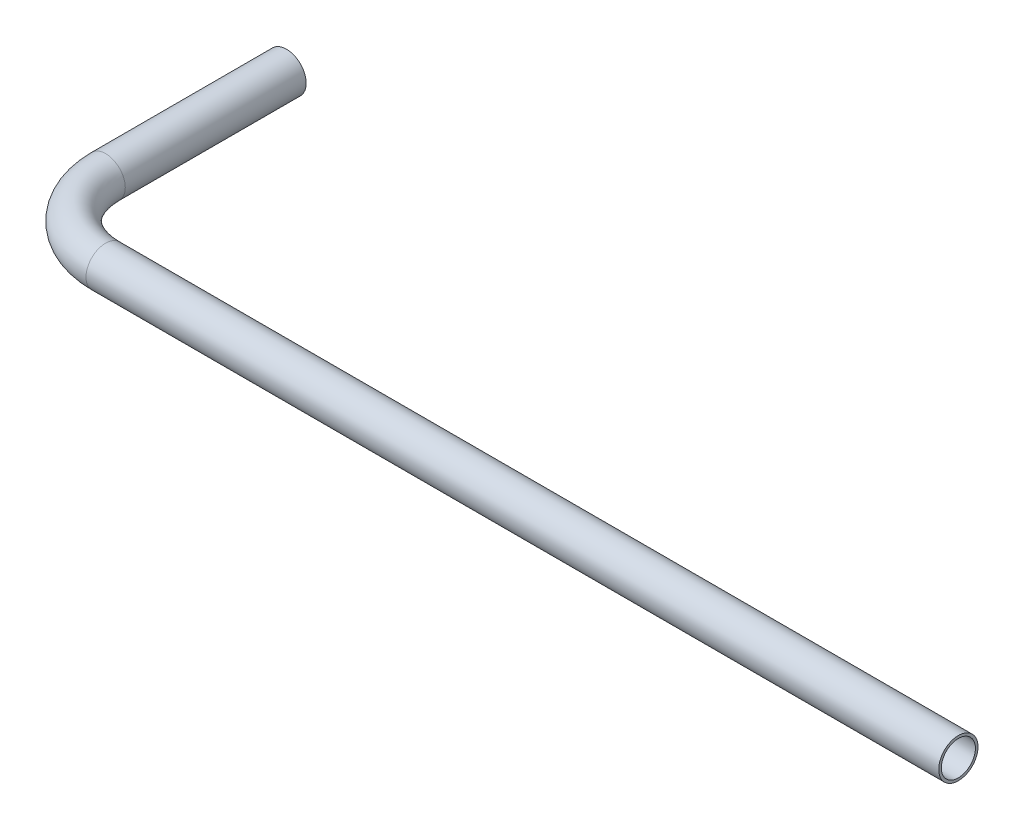
ISO-10303-21;
HEADER;
FILE_DESCRIPTION(('STEP AP214'),'2;1');
FILE_NAME('part.step','',(''),(''),'','','');
FILE_SCHEMA(('AUTOMOTIVE_DESIGN { 1 0 10303 214 1 1 1 1 }'));
ENDSEC;
DATA;
#1=APPLICATION_CONTEXT('core data for automotive mechanical design processes');
#2=APPLICATION_PROTOCOL_DEFINITION('international standard','automotive_design',2000,#1);
#3=PRODUCT_CONTEXT('',#1,'mechanical');
#4=PRODUCT('Part','Part','',(#3));
#5=PRODUCT_RELATED_PRODUCT_CATEGORY('part','',(#4));
#6=PRODUCT_DEFINITION_FORMATION('','',#4);
#7=PRODUCT_DEFINITION_CONTEXT('part definition',#1,'design');
#8=PRODUCT_DEFINITION('design','',#6,#7);
#9=PRODUCT_DEFINITION_SHAPE('','',#8);
#10=(LENGTH_UNIT() NAMED_UNIT(*) SI_UNIT(.MILLI.,.METRE.));
#11=(NAMED_UNIT(*) PLANE_ANGLE_UNIT() SI_UNIT($,.RADIAN.));
#12=(NAMED_UNIT(*) SI_UNIT($,.STERADIAN.) SOLID_ANGLE_UNIT());
#13=UNCERTAINTY_MEASURE_WITH_UNIT(LENGTH_MEASURE(1.E-05),#10,'distance_accuracy_value','');
#14=(GEOMETRIC_REPRESENTATION_CONTEXT(3) GLOBAL_UNCERTAINTY_ASSIGNED_CONTEXT((#13)) GLOBAL_UNIT_ASSIGNED_CONTEXT((#10,
#11,#12)) REPRESENTATION_CONTEXT('',''));
#15=CARTESIAN_POINT('',(0.,0.,0.));
#16=DIRECTION('',(0.,0.,1.));
#17=DIRECTION('',(1.,0.,0.));
#18=AXIS2_PLACEMENT_3D('',#15,#16,#17);
#19=CARTESIAN_POINT('',(-8.88178419700125E-13,-2.66453525910038E-12,0.));
#20=DIRECTION('',(0.,0.,1.));
#21=DIRECTION('',(1.,0.,0.));
#22=AXIS2_PLACEMENT_3D('',#19,#20,#21);
#23=CYLINDRICAL_SURFACE('',#22,4.826);
#24=CARTESIAN_POINT('',(-8.88178419700125E-13,-2.66453525910038E-12,44.45));
#25=DIRECTION('',(0.,0.,1.));
#26=DIRECTION('',(1.,0.,0.));
#27=AXIS2_PLACEMENT_3D('',#24,#25,#26);
#28=CIRCLE('',#27,4.826);
#29=CARTESIAN_POINT('',(-4.82600000000089,-2.66414124940353E-12,44.45));
#30=VERTEX_POINT('',#29);
#31=EDGE_CURVE('E68',#30,#30,#28,.T.);
#32=ORIENTED_EDGE('',*,*,#31,.F.);
#33=EDGE_LOOP('',(#32));
#34=FACE_BOUND('',#33,.T.);
#35=CARTESIAN_POINT('',(-8.88178419700125E-13,-2.66453525910038E-12,0.));
#36=DIRECTION('',(0.,0.,1.));
#37=DIRECTION('',(1.,0.,0.));
#38=AXIS2_PLACEMENT_3D('',#35,#36,#37);
#39=CIRCLE('',#38,4.826);
#40=CARTESIAN_POINT('',(4.82599999999911,-2.66453525910038E-12,0.));
#41=VERTEX_POINT('',#40);
#42=EDGE_CURVE('E65',#41,#41,#39,.T.);
#43=ORIENTED_EDGE('',*,*,#42,.T.);
#44=EDGE_LOOP('',(#43));
#45=FACE_BOUND('',#44,.T.);
#46=ADVANCED_FACE('F41',(#34,#45),#23,.T.);
#47=CARTESIAN_POINT('',(19.05,-2.66609056053529E-12,44.45));
#48=DIRECTION('',(0.,1.,0.));
#49=DIRECTION('',(0.,0.,1.));
#50=AXIS2_PLACEMENT_3D('',#47,#48,#49);
#51=TOROIDAL_SURFACE('',#50,19.0500000000009,4.826);
#52=CARTESIAN_POINT('',(19.05,-2.66609056053529E-12,63.5000000000009));
#53=DIRECTION('',(1.,0.,0.));
#54=DIRECTION('',(0.,0.,-1.));
#55=AXIS2_PLACEMENT_3D('',#52,#53,#54);
#56=CIRCLE('',#55,4.826);
#57=CARTESIAN_POINT('',(19.05,-2.66609056053529E-12,68.3260000000009));
#58=VERTEX_POINT('',#57);
#59=EDGE_CURVE('E45',#58,#58,#56,.T.);
#60=CARTESIAN_POINT('',(19.05,-2.66609056053529E-12,44.45));
#61=DIRECTION('',(0.,1.,0.));
#62=DIRECTION('',(0.,0.,1.));
#63=AXIS2_PLACEMENT_3D('',#60,#61,#62);
#64=CIRCLE('',#63,23.8760000000009);
#65=EDGE_CURVE('',#30,#58,#64,.T.);
#66=ORIENTED_EDGE('',*,*,#31,.T.);
#67=ORIENTED_EDGE('',*,*,#59,.F.);
#68=ORIENTED_EDGE('',*,*,#65,.T.);
#69=ORIENTED_EDGE('',*,*,#65,.F.);
#70=EDGE_LOOP('',(#66,#68,#67,#69));
#71=FACE_BOUND('',#70,.T.);
#72=ADVANCED_FACE('F78',(#71),#51,.T.);
#73=CARTESIAN_POINT('',(19.05,-2.66453525910038E-12,63.5000000000009));
#74=DIRECTION('',(1.,0.,0.));
#75=DIRECTION('',(0.,0.,-1.));
#76=AXIS2_PLACEMENT_3D('',#73,#74,#75);
#77=CYLINDRICAL_SURFACE('',#76,4.826);
#78=CARTESIAN_POINT('',(228.6,-2.66453525910038E-12,63.5000000000009));
#79=DIRECTION('',(1.,0.,0.));
#80=DIRECTION('',(0.,0.,-1.));
#81=AXIS2_PLACEMENT_3D('',#78,#79,#80);
#82=CIRCLE('',#81,4.826);
#83=CARTESIAN_POINT('',(228.6,-2.66453525910038E-12,58.6740000000009));
#84=VERTEX_POINT('',#83);
#85=EDGE_CURVE('E60',#84,#84,#82,.T.);
#86=ORIENTED_EDGE('',*,*,#85,.F.);
#87=EDGE_LOOP('',(#86));
#88=FACE_BOUND('',#87,.T.);
#89=ORIENTED_EDGE('',*,*,#59,.T.);
#90=EDGE_LOOP('',(#89));
#91=FACE_BOUND('',#90,.T.);
#92=ADVANCED_FACE('F43',(#88,#91),#77,.T.);
#93=CARTESIAN_POINT('',(-8.88178419700125E-13,-2.66453525910038E-12,0.));
#94=DIRECTION('',(0.,0.,1.));
#95=DIRECTION('',(1.,0.,0.));
#96=AXIS2_PLACEMENT_3D('',#93,#94,#95);
#97=PLANE('',#96);
#98=CARTESIAN_POINT('',(-8.88178419700125E-13,-2.66453525910038E-12,0.));
#99=DIRECTION('',(0.,0.,1.));
#100=DIRECTION('',(1.,0.,0.));
#101=AXIS2_PLACEMENT_3D('',#98,#99,#100);
#102=CIRCLE('',#101,4.191);
#103=CARTESIAN_POINT('',(4.19099999999911,-2.66453525910038E-12,0.));
#104=VERTEX_POINT('',#103);
#105=EDGE_CURVE('E64',#104,#104,#102,.F.);
#106=ORIENTED_EDGE('',*,*,#105,.F.);
#107=EDGE_LOOP('',(#106));
#108=FACE_BOUND('',#107,.T.);
#109=ORIENTED_EDGE('',*,*,#42,.F.);
#110=EDGE_LOOP('',(#109));
#111=FACE_BOUND('',#110,.T.);
#112=ADVANCED_FACE('F84',(#108,#111),#97,.F.);
#113=CARTESIAN_POINT('',(228.6,-2.66453525910038E-12,63.5000000000009));
#114=DIRECTION('',(1.,0.,0.));
#115=DIRECTION('',(0.,0.,-1.));
#116=AXIS2_PLACEMENT_3D('',#113,#114,#115);
#117=PLANE('',#116);
#118=CARTESIAN_POINT('',(228.6,-2.66453525910038E-12,63.5000000000009));
#119=DIRECTION('',(1.,0.,0.));
#120=DIRECTION('',(0.,0.,-1.));
#121=AXIS2_PLACEMENT_3D('',#118,#119,#120);
#122=CIRCLE('',#121,4.191);
#123=CARTESIAN_POINT('',(228.6,-2.66453525910038E-12,59.3090000000009));
#124=VERTEX_POINT('',#123);
#125=EDGE_CURVE('E10',#124,#124,#122,.F.);
#126=ORIENTED_EDGE('',*,*,#125,.T.);
#127=EDGE_LOOP('',(#126));
#128=FACE_BOUND('',#127,.T.);
#129=ORIENTED_EDGE('',*,*,#85,.T.);
#130=EDGE_LOOP('',(#129));
#131=FACE_BOUND('',#130,.T.);
#132=ADVANCED_FACE('F102',(#128,#131),#117,.T.);
#133=CARTESIAN_POINT('',(-8.88178419700125E-13,-2.66453525910038E-12,0.));
#134=DIRECTION('',(0.,0.,1.));
#135=DIRECTION('',(1.,0.,0.));
#136=AXIS2_PLACEMENT_3D('',#133,#134,#135);
#137=CYLINDRICAL_SURFACE('',#136,4.191);
#138=CARTESIAN_POINT('',(-8.88178419700125E-13,-2.66453525910038E-12,44.45));
#139=DIRECTION('',(0.,0.,1.));
#140=DIRECTION('',(1.,0.,0.));
#141=AXIS2_PLACEMENT_3D('',#138,#139,#140);
#142=CIRCLE('',#141,4.191);
#143=CARTESIAN_POINT('',(-4.19100000000089,-2.66419309278469E-12,44.45));
#144=VERTEX_POINT('',#143);
#145=EDGE_CURVE('E56',#144,#144,#142,.F.);
#146=ORIENTED_EDGE('',*,*,#145,.F.);
#147=EDGE_LOOP('',(#146));
#148=FACE_BOUND('',#147,.T.);
#149=ORIENTED_EDGE('',*,*,#105,.T.);
#150=EDGE_LOOP('',(#149));
#151=FACE_BOUND('',#150,.T.);
#152=ADVANCED_FACE('F96',(#148,#151),#137,.F.);
#153=CARTESIAN_POINT('',(19.05,-2.66609056053529E-12,44.45));
#154=DIRECTION('',(0.,1.,0.));
#155=DIRECTION('',(0.,0.,1.));
#156=AXIS2_PLACEMENT_3D('',#153,#154,#155);
#157=TOROIDAL_SURFACE('',#156,19.0500000000009,4.191);
#158=CARTESIAN_POINT('',(19.05,-2.66609056053529E-12,63.5000000000009));
#159=DIRECTION('',(1.,0.,0.));
#160=DIRECTION('',(0.,0.,-1.));
#161=AXIS2_PLACEMENT_3D('',#158,#159,#160);
#162=CIRCLE('',#161,4.191);
#163=CARTESIAN_POINT('',(19.05,-2.66609056053529E-12,67.6910000000009));
#164=VERTEX_POINT('',#163);
#165=EDGE_CURVE('E50',#164,#164,#162,.F.);
#166=CARTESIAN_POINT('',(19.05,-2.66609056053529E-12,44.45));
#167=DIRECTION('',(0.,1.,0.));
#168=DIRECTION('',(0.,0.,1.));
#169=AXIS2_PLACEMENT_3D('',#166,#167,#168);
#170=CIRCLE('',#169,23.2410000000009);
#171=EDGE_CURVE('',#144,#164,#170,.T.);
#172=ORIENTED_EDGE('',*,*,#145,.T.);
#173=ORIENTED_EDGE('',*,*,#165,.F.);
#174=ORIENTED_EDGE('',*,*,#171,.T.);
#175=ORIENTED_EDGE('',*,*,#171,.F.);
#176=EDGE_LOOP('',(#172,#174,#173,#175));
#177=FACE_BOUND('',#176,.T.);
#178=ADVANCED_FACE('F90',(#177),#157,.F.);
#179=CARTESIAN_POINT('',(19.05,-2.66453525910038E-12,63.5000000000009));
#180=DIRECTION('',(1.,0.,0.));
#181=DIRECTION('',(0.,0.,-1.));
#182=AXIS2_PLACEMENT_3D('',#179,#180,#181);
#183=CYLINDRICAL_SURFACE('',#182,4.191);
#184=ORIENTED_EDGE('',*,*,#125,.F.);
#185=EDGE_LOOP('',(#184));
#186=FACE_BOUND('',#185,.T.);
#187=ORIENTED_EDGE('',*,*,#165,.T.);
#188=EDGE_LOOP('',(#187));
#189=FACE_BOUND('',#188,.T.);
#190=ADVANCED_FACE('F88',(#186,#189),#183,.F.);
#191=CLOSED_SHELL('',(#46,#72,#92,#112,#132,#152,#178,#190));
#192=MANIFOLD_SOLID_BREP('B2',#191);
#193=ADVANCED_BREP_SHAPE_REPRESENTATION('',(#18,#192),#14);
#194=SHAPE_DEFINITION_REPRESENTATION(#9,#193);
ENDSEC;
END-ISO-10303-21;
